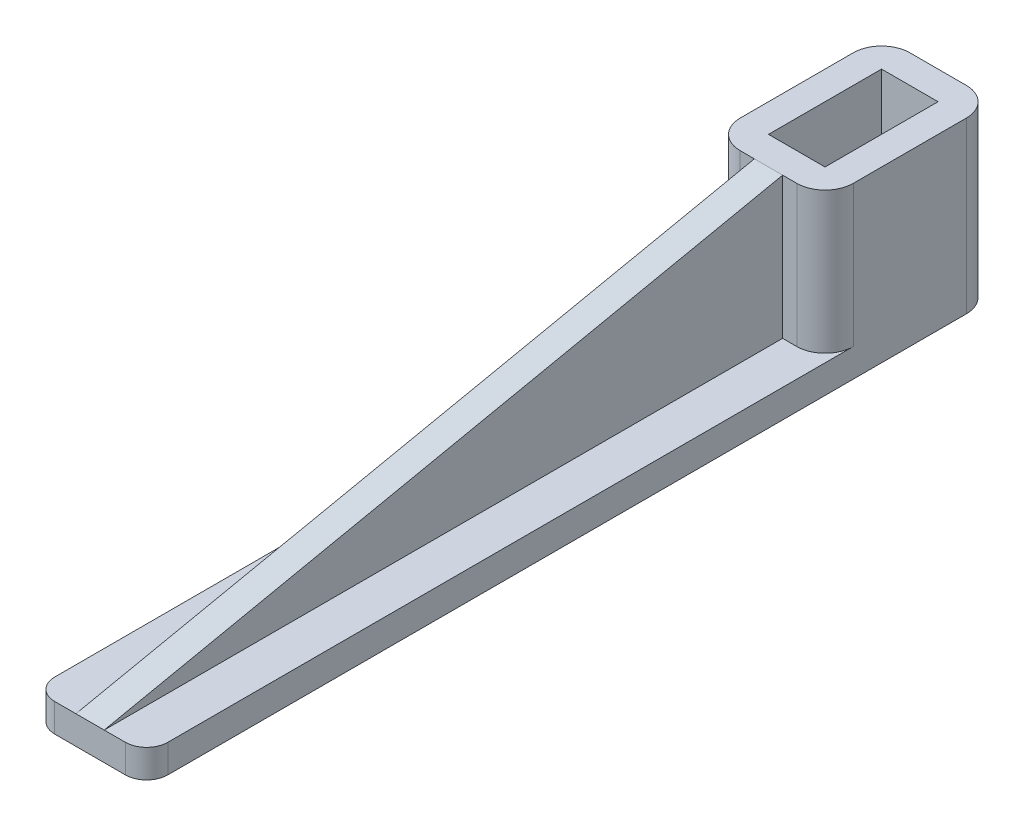
ISO-10303-21;
HEADER;
FILE_DESCRIPTION(('STEP AP214'),'2;1');
FILE_NAME('part.step','',(''),(''),'','','');
FILE_SCHEMA(('AUTOMOTIVE_DESIGN { 1 0 10303 214 1 1 1 1 }'));
ENDSEC;
DATA;
#1=APPLICATION_CONTEXT('core data for automotive mechanical design processes');
#2=APPLICATION_PROTOCOL_DEFINITION('international standard','automotive_design',2000,#1);
#3=PRODUCT_CONTEXT('',#1,'mechanical');
#4=PRODUCT('Part','Part','',(#3));
#5=PRODUCT_RELATED_PRODUCT_CATEGORY('part','',(#4));
#6=PRODUCT_DEFINITION_FORMATION('','',#4);
#7=PRODUCT_DEFINITION_CONTEXT('part definition',#1,'design');
#8=PRODUCT_DEFINITION('design','',#6,#7);
#9=PRODUCT_DEFINITION_SHAPE('','',#8);
#10=(LENGTH_UNIT() NAMED_UNIT(*) SI_UNIT(.MILLI.,.METRE.));
#11=(NAMED_UNIT(*) PLANE_ANGLE_UNIT() SI_UNIT($,.RADIAN.));
#12=(NAMED_UNIT(*) SI_UNIT($,.STERADIAN.) SOLID_ANGLE_UNIT());
#13=UNCERTAINTY_MEASURE_WITH_UNIT(LENGTH_MEASURE(1.E-05),#10,'distance_accuracy_value','');
#14=(GEOMETRIC_REPRESENTATION_CONTEXT(3) GLOBAL_UNCERTAINTY_ASSIGNED_CONTEXT((#13)) GLOBAL_UNIT_ASSIGNED_CONTEXT((#10,
#11,#12)) REPRESENTATION_CONTEXT('',''));
#15=CARTESIAN_POINT('',(0.,0.,0.));
#16=DIRECTION('',(0.,0.,1.));
#17=DIRECTION('',(1.,0.,0.));
#18=AXIS2_PLACEMENT_3D('',#15,#16,#17);
#19=CARTESIAN_POINT('',(0.,30.,15.));
#20=DIRECTION('',(0.,0.,-1.));
#21=DIRECTION('',(-1.,0.,0.));
#22=AXIS2_PLACEMENT_3D('',#19,#20,#21);
#23=PLANE('',#22);
#24=DIRECTION('',(1.,0.,0.));
#25=VECTOR('',#24,1.);
#26=CARTESIAN_POINT('',(0.,30.,15.));
#27=LINE('',#26,#25);
#28=CARTESIAN_POINT('',(-5.,30.,15.));
#29=VERTEX_POINT('',#28);
#30=CARTESIAN_POINT('',(-2.5,30.,15.0000000000001));
#31=VERTEX_POINT('',#30);
#32=EDGE_CURVE('E229',#29,#31,#27,.T.);
#33=ORIENTED_EDGE('',*,*,#32,.F.);
#34=DIRECTION('',(0.,-1.,0.));
#35=VECTOR('',#34,1.);
#36=CARTESIAN_POINT('',(-5.,5.,15.));
#37=LINE('',#36,#35);
#38=CARTESIAN_POINT('',(-5.,5.,15.));
#39=VERTEX_POINT('',#38);
#40=EDGE_CURVE('E263',#29,#39,#37,.T.);
#41=ORIENTED_EDGE('',*,*,#40,.T.);
#42=DIRECTION('',(1.,0.,0.));
#43=VECTOR('',#42,1.);
#44=CARTESIAN_POINT('',(0.,5.,15.));
#45=LINE('',#44,#43);
#46=CARTESIAN_POINT('',(-2.5,5.,15.));
#47=VERTEX_POINT('',#46);
#48=EDGE_CURVE('E345',#39,#47,#45,.T.);
#49=ORIENTED_EDGE('',*,*,#48,.T.);
#50=DIRECTION('',(0.,-1.,0.));
#51=VECTOR('',#50,1.);
#52=CARTESIAN_POINT('',(-2.5,30.,15.));
#53=LINE('',#52,#51);
#54=EDGE_CURVE('E174',#31,#47,#53,.T.);
#55=ORIENTED_EDGE('',*,*,#54,.F.);
#56=EDGE_LOOP('',(#33,#41,#49,#55));
#57=FACE_BOUND('',#56,.T.);
#58=ADVANCED_FACE('F37',(#57),#23,.F.);
#59=CARTESIAN_POINT('',(0.,5.,0.));
#60=DIRECTION('',(0.,1.,0.));
#61=DIRECTION('',(0.,0.,1.));
#62=AXIS2_PLACEMENT_3D('',#59,#60,#61);
#63=PLANE('',#62);
#64=DIRECTION('',(0.,0.,-1.));
#65=VECTOR('',#64,1.);
#66=CARTESIAN_POINT('',(-10.,5.,0.));
#67=LINE('',#66,#65);
#68=CARTESIAN_POINT('',(-9.99999999999999,5.,131.25));
#69=VERTEX_POINT('',#68);
#70=CARTESIAN_POINT('',(-10.,5.,10.));
#71=VERTEX_POINT('',#70);
#72=EDGE_CURVE('E201',#69,#71,#67,.T.);
#73=ORIENTED_EDGE('',*,*,#72,.F.);
#74=CARTESIAN_POINT('',(-6.25,5.,131.25));
#75=DIRECTION('',(0.,1.,0.));
#76=DIRECTION('',(0.,0.,1.));
#77=AXIS2_PLACEMENT_3D('',#74,#75,#76);
#78=CIRCLE('',#77,3.75);
#79=CARTESIAN_POINT('',(-6.25,5.,135.));
#80=VERTEX_POINT('',#79);
#81=EDGE_CURVE('E197',#69,#80,#78,.T.);
#82=ORIENTED_EDGE('',*,*,#81,.T.);
#83=DIRECTION('',(-1.,0.,0.));
#84=VECTOR('',#83,1.);
#85=CARTESIAN_POINT('',(0.,5.,135.));
#86=LINE('',#85,#84);
#87=CARTESIAN_POINT('',(-2.5,5.,135.));
#88=VERTEX_POINT('',#87);
#89=EDGE_CURVE('E194',#88,#80,#86,.T.);
#90=ORIENTED_EDGE('',*,*,#89,.F.);
#91=DIRECTION('',(0.,0.,-1.));
#92=VECTOR('',#91,1.);
#93=CARTESIAN_POINT('',(-2.5,5.,0.));
#94=LINE('',#93,#92);
#95=EDGE_CURVE('E169',#88,#47,#94,.T.);
#96=ORIENTED_EDGE('',*,*,#95,.T.);
#97=ORIENTED_EDGE('',*,*,#48,.F.);
#98=CARTESIAN_POINT('',(-5.,5.,10.));
#99=DIRECTION('',(0.,1.,0.));
#100=DIRECTION('',(0.,0.,1.));
#101=AXIS2_PLACEMENT_3D('',#98,#99,#100);
#102=CIRCLE('',#101,5.);
#103=EDGE_CURVE('E295',#39,#71,#102,.F.);
#104=ORIENTED_EDGE('',*,*,#103,.T.);
#105=EDGE_LOOP('',(#73,#82,#90,#96,#97,#104));
#106=FACE_BOUND('',#105,.T.);
#107=ADVANCED_FACE('F195',(#106),#63,.T.);
#108=CARTESIAN_POINT('',(-10.,30.,0.));
#109=DIRECTION('',(-1.,0.,0.));
#110=DIRECTION('',(0.,0.,1.));
#111=AXIS2_PLACEMENT_3D('',#108,#109,#110);
#112=PLANE('',#111);
#113=DIRECTION('',(0.,0.,-1.));
#114=VECTOR('',#113,1.);
#115=CARTESIAN_POINT('',(-10.,0.,0.));
#116=LINE('',#115,#114);
#117=CARTESIAN_POINT('',(-9.99999999999999,0.,131.25));
#118=VERTEX_POINT('',#117);
#119=CARTESIAN_POINT('',(-10.,0.,-9.99999999999999));
#120=VERTEX_POINT('',#119);
#121=EDGE_CURVE('E246',#118,#120,#116,.T.);
#122=ORIENTED_EDGE('',*,*,#121,.F.);
#123=DIRECTION('',(0.,-1.,0.));
#124=VECTOR('',#123,1.);
#125=CARTESIAN_POINT('',(-9.99999999999999,30.,131.25));
#126=LINE('',#125,#124);
#127=EDGE_CURVE('E58',#118,#69,#126,.F.);
#128=ORIENTED_EDGE('',*,*,#127,.T.);
#129=ORIENTED_EDGE('',*,*,#72,.T.);
#130=DIRECTION('',(0.,-1.,0.));
#131=VECTOR('',#130,1.);
#132=CARTESIAN_POINT('',(-10.,30.,10.));
#133=LINE('',#132,#131);
#134=CARTESIAN_POINT('',(-10.,30.,10.));
#135=VERTEX_POINT('',#134);
#136=EDGE_CURVE('E269',#71,#135,#133,.F.);
#137=ORIENTED_EDGE('',*,*,#136,.T.);
#138=DIRECTION('',(0.,0.,-1.));
#139=VECTOR('',#138,1.);
#140=CARTESIAN_POINT('',(-10.,30.,0.));
#141=LINE('',#140,#139);
#142=CARTESIAN_POINT('',(-10.,30.,-9.99999999999999));
#143=VERTEX_POINT('',#142);
#144=EDGE_CURVE('E225',#135,#143,#141,.T.);
#145=ORIENTED_EDGE('',*,*,#144,.T.);
#146=DIRECTION('',(0.,-1.,0.));
#147=VECTOR('',#146,1.);
#148=CARTESIAN_POINT('',(-10.,30.,-9.99999999999999));
#149=LINE('',#148,#147);
#150=EDGE_CURVE('E266',#143,#120,#149,.T.);
#151=ORIENTED_EDGE('',*,*,#150,.T.);
#152=EDGE_LOOP('',(#122,#128,#129,#137,#145,#151));
#153=FACE_BOUND('',#152,.T.);
#154=ADVANCED_FACE('F337',(#153),#112,.T.);
#155=CARTESIAN_POINT('',(2.5,5.,15.));
#156=VERTEX_POINT('',#155);
#157=CARTESIAN_POINT('',(5.,5.,15.));
#158=VERTEX_POINT('',#157);
#159=EDGE_CURVE('E214',#156,#158,#45,.T.);
#160=ORIENTED_EDGE('',*,*,#159,.T.);
#161=DIRECTION('',(0.,-1.,0.));
#162=VECTOR('',#161,1.);
#163=CARTESIAN_POINT('',(5.,30.,15.));
#164=LINE('',#163,#162);
#165=CARTESIAN_POINT('',(5.,30.,15.));
#166=VERTEX_POINT('',#165);
#167=EDGE_CURVE('E293',#158,#166,#164,.F.);
#168=ORIENTED_EDGE('',*,*,#167,.T.);
#169=CARTESIAN_POINT('',(2.5,30.,15.0000000000001));
#170=VERTEX_POINT('',#169);
#171=EDGE_CURVE('E228',#170,#166,#27,.T.);
#172=ORIENTED_EDGE('',*,*,#171,.F.);
#173=DIRECTION('',(0.,-1.,0.));
#174=VECTOR('',#173,1.);
#175=CARTESIAN_POINT('',(2.5,30.,15.));
#176=LINE('',#175,#174);
#177=EDGE_CURVE('E349',#170,#156,#176,.T.);
#178=ORIENTED_EDGE('',*,*,#177,.T.);
#179=EDGE_LOOP('',(#160,#168,#172,#178));
#180=FACE_BOUND('',#179,.T.);
#181=ADVANCED_FACE('F358',(#180),#23,.F.);
#182=CARTESIAN_POINT('',(10.,30.,0.));
#183=DIRECTION('',(1.,0.,0.));
#184=DIRECTION('',(0.,0.,-1.));
#185=AXIS2_PLACEMENT_3D('',#182,#183,#184);
#186=PLANE('',#185);
#187=DIRECTION('',(0.,0.,1.));
#188=VECTOR('',#187,1.);
#189=CARTESIAN_POINT('',(10.,5.,0.));
#190=LINE('',#189,#188);
#191=CARTESIAN_POINT('',(10.,5.,10.));
#192=VERTEX_POINT('',#191);
#193=CARTESIAN_POINT('',(10.,5.,131.25));
#194=VERTEX_POINT('',#193);
#195=EDGE_CURVE('E205',#192,#194,#190,.T.);
#196=ORIENTED_EDGE('',*,*,#195,.T.);
#197=DIRECTION('',(0.,-1.,0.));
#198=VECTOR('',#197,1.);
#199=CARTESIAN_POINT('',(10.,30.,131.25));
#200=LINE('',#199,#198);
#201=CARTESIAN_POINT('',(10.,0.,131.25));
#202=VERTEX_POINT('',#201);
#203=EDGE_CURVE('E45',#194,#202,#200,.T.);
#204=ORIENTED_EDGE('',*,*,#203,.T.);
#205=DIRECTION('',(0.,0.,1.));
#206=VECTOR('',#205,1.);
#207=CARTESIAN_POINT('',(10.,0.,0.));
#208=LINE('',#207,#206);
#209=CARTESIAN_POINT('',(10.,0.,-10.));
#210=VERTEX_POINT('',#209);
#211=EDGE_CURVE('E248',#210,#202,#208,.T.);
#212=ORIENTED_EDGE('',*,*,#211,.F.);
#213=DIRECTION('',(0.,-1.,0.));
#214=VECTOR('',#213,1.);
#215=CARTESIAN_POINT('',(10.,30.,-10.));
#216=LINE('',#215,#214);
#217=CARTESIAN_POINT('',(10.,30.,-10.));
#218=VERTEX_POINT('',#217);
#219=EDGE_CURVE('E291',#210,#218,#216,.F.);
#220=ORIENTED_EDGE('',*,*,#219,.T.);
#221=DIRECTION('',(0.,0.,1.));
#222=VECTOR('',#221,1.);
#223=CARTESIAN_POINT('',(10.,30.,0.));
#224=LINE('',#223,#222);
#225=CARTESIAN_POINT('',(10.,30.,10.));
#226=VERTEX_POINT('',#225);
#227=EDGE_CURVE('E231',#218,#226,#224,.T.);
#228=ORIENTED_EDGE('',*,*,#227,.T.);
#229=DIRECTION('',(0.,-1.,0.));
#230=VECTOR('',#229,1.);
#231=CARTESIAN_POINT('',(10.,5.,10.));
#232=LINE('',#231,#230);
#233=EDGE_CURVE('E288',#226,#192,#232,.T.);
#234=ORIENTED_EDGE('',*,*,#233,.T.);
#235=EDGE_LOOP('',(#196,#204,#212,#220,#228,#234));
#236=FACE_BOUND('',#235,.T.);
#237=ADVANCED_FACE('F313',(#236),#186,.T.);
#238=CARTESIAN_POINT('',(-5.,30.,0.));
#239=DIRECTION('',(1.,0.,0.));
#240=DIRECTION('',(0.,0.,-1.));
#241=AXIS2_PLACEMENT_3D('',#238,#239,#240);
#242=PLANE('',#241);
#243=DIRECTION('',(0.,0.,1.));
#244=VECTOR('',#243,1.);
#245=CARTESIAN_POINT('',(-5.,0.,0.));
#246=LINE('',#245,#244);
#247=CARTESIAN_POINT('',(-5.,0.,-10.));
#248=VERTEX_POINT('',#247);
#249=CARTESIAN_POINT('',(-5.,0.,10.));
#250=VERTEX_POINT('',#249);
#251=EDGE_CURVE('E210',#248,#250,#246,.T.);
#252=ORIENTED_EDGE('',*,*,#251,.F.);
#253=DIRECTION('',(0.,-1.,0.));
#254=VECTOR('',#253,1.);
#255=CARTESIAN_POINT('',(-5.,30.,-10.));
#256=LINE('',#255,#254);
#257=CARTESIAN_POINT('',(-5.,30.,-10.));
#258=VERTEX_POINT('',#257);
#259=EDGE_CURVE('E179',#258,#248,#256,.T.);
#260=ORIENTED_EDGE('',*,*,#259,.F.);
#261=DIRECTION('',(0.,0.,1.));
#262=VECTOR('',#261,1.);
#263=CARTESIAN_POINT('',(-5.,30.,0.));
#264=LINE('',#263,#262);
#265=CARTESIAN_POINT('',(-5.,30.,10.));
#266=VERTEX_POINT('',#265);
#267=EDGE_CURVE('E215',#258,#266,#264,.T.);
#268=ORIENTED_EDGE('',*,*,#267,.T.);
#269=DIRECTION('',(0.,-1.,0.));
#270=VECTOR('',#269,1.);
#271=CARTESIAN_POINT('',(-5.,30.,10.));
#272=LINE('',#271,#270);
#273=EDGE_CURVE('E237',#266,#250,#272,.T.);
#274=ORIENTED_EDGE('',*,*,#273,.T.);
#275=EDGE_LOOP('',(#252,#260,#268,#274));
#276=FACE_BOUND('',#275,.T.);
#277=ADVANCED_FACE('F389',(#276),#242,.T.);
#278=CARTESIAN_POINT('',(0.,30.,-10.));
#279=DIRECTION('',(0.,0.,1.));
#280=DIRECTION('',(1.,0.,0.));
#281=AXIS2_PLACEMENT_3D('',#278,#279,#280);
#282=PLANE('',#281);
#283=DIRECTION('',(-1.,0.,0.));
#284=VECTOR('',#283,1.);
#285=CARTESIAN_POINT('',(0.,30.,-10.));
#286=LINE('',#285,#284);
#287=CARTESIAN_POINT('',(5.,30.,-10.));
#288=VERTEX_POINT('',#287);
#289=EDGE_CURVE('E218',#288,#258,#286,.T.);
#290=ORIENTED_EDGE('',*,*,#289,.T.);
#291=ORIENTED_EDGE('',*,*,#259,.T.);
#292=DIRECTION('',(-1.,0.,0.));
#293=VECTOR('',#292,1.);
#294=CARTESIAN_POINT('',(0.,0.,-10.));
#295=LINE('',#294,#293);
#296=CARTESIAN_POINT('',(5.,0.,-10.));
#297=VERTEX_POINT('',#296);
#298=EDGE_CURVE('E240',#297,#248,#295,.T.);
#299=ORIENTED_EDGE('',*,*,#298,.F.);
#300=DIRECTION('',(0.,-1.,0.));
#301=VECTOR('',#300,1.);
#302=CARTESIAN_POINT('',(5.,30.,-10.));
#303=LINE('',#302,#301);
#304=EDGE_CURVE('E258',#288,#297,#303,.T.);
#305=ORIENTED_EDGE('',*,*,#304,.F.);
#306=EDGE_LOOP('',(#290,#291,#299,#305));
#307=FACE_BOUND('',#306,.T.);
#308=ADVANCED_FACE('F400',(#307),#282,.T.);
#309=CARTESIAN_POINT('',(5.,30.,0.));
#310=DIRECTION('',(1.,0.,0.));
#311=DIRECTION('',(0.,0.,-1.));
#312=AXIS2_PLACEMENT_3D('',#309,#310,#311);
#313=PLANE('',#312);
#314=DIRECTION('',(0.,0.,1.));
#315=VECTOR('',#314,1.);
#316=CARTESIAN_POINT('',(5.,0.,0.));
#317=LINE('',#316,#315);
#318=CARTESIAN_POINT('',(5.,0.,10.));
#319=VERTEX_POINT('',#318);
#320=EDGE_CURVE('E242',#297,#319,#317,.T.);
#321=ORIENTED_EDGE('',*,*,#320,.T.);
#322=DIRECTION('',(0.,-1.,0.));
#323=VECTOR('',#322,1.);
#324=CARTESIAN_POINT('',(5.,30.,10.));
#325=LINE('',#324,#323);
#326=CARTESIAN_POINT('',(5.,30.,10.));
#327=VERTEX_POINT('',#326);
#328=EDGE_CURVE('E255',#327,#319,#325,.T.);
#329=ORIENTED_EDGE('',*,*,#328,.F.);
#330=DIRECTION('',(0.,0.,1.));
#331=VECTOR('',#330,1.);
#332=CARTESIAN_POINT('',(5.,30.,0.));
#333=LINE('',#332,#331);
#334=EDGE_CURVE('E221',#288,#327,#333,.T.);
#335=ORIENTED_EDGE('',*,*,#334,.F.);
#336=ORIENTED_EDGE('',*,*,#304,.T.);
#337=EDGE_LOOP('',(#321,#329,#335,#336));
#338=FACE_BOUND('',#337,.T.);
#339=ADVANCED_FACE('F396',(#338),#313,.F.);
#340=CARTESIAN_POINT('',(0.,30.,10.));
#341=DIRECTION('',(0.,0.,1.));
#342=DIRECTION('',(1.,0.,0.));
#343=AXIS2_PLACEMENT_3D('',#340,#341,#342);
#344=PLANE('',#343);
#345=DIRECTION('',(-1.,0.,0.));
#346=VECTOR('',#345,1.);
#347=CARTESIAN_POINT('',(0.,0.,10.));
#348=LINE('',#347,#346);
#349=EDGE_CURVE('E244',#319,#250,#348,.T.);
#350=ORIENTED_EDGE('',*,*,#349,.T.);
#351=ORIENTED_EDGE('',*,*,#273,.F.);
#352=DIRECTION('',(-1.,0.,0.));
#353=VECTOR('',#352,1.);
#354=CARTESIAN_POINT('',(0.,30.,10.));
#355=LINE('',#354,#353);
#356=EDGE_CURVE('E223',#327,#266,#355,.T.);
#357=ORIENTED_EDGE('',*,*,#356,.F.);
#358=ORIENTED_EDGE('',*,*,#328,.T.);
#359=EDGE_LOOP('',(#350,#351,#357,#358));
#360=FACE_BOUND('',#359,.T.);
#361=ADVANCED_FACE('F393',(#360),#344,.F.);
#362=CARTESIAN_POINT('',(0.,30.,-15.));
#363=DIRECTION('',(0.,0.,-1.));
#364=DIRECTION('',(-1.,0.,0.));
#365=AXIS2_PLACEMENT_3D('',#362,#363,#364);
#366=PLANE('',#365);
#367=DIRECTION('',(1.,0.,0.));
#368=VECTOR('',#367,1.);
#369=CARTESIAN_POINT('',(0.,0.,-15.));
#370=LINE('',#369,#368);
#371=CARTESIAN_POINT('',(-5.,0.,-15.));
#372=VERTEX_POINT('',#371);
#373=CARTESIAN_POINT('',(5.,0.,-15.));
#374=VERTEX_POINT('',#373);
#375=EDGE_CURVE('E219',#372,#374,#370,.T.);
#376=ORIENTED_EDGE('',*,*,#375,.F.);
#377=DIRECTION('',(0.,-1.,0.));
#378=VECTOR('',#377,1.);
#379=CARTESIAN_POINT('',(-5.,30.,-15.));
#380=LINE('',#379,#378);
#381=CARTESIAN_POINT('',(-5.,30.,-15.));
#382=VERTEX_POINT('',#381);
#383=EDGE_CURVE('E286',#372,#382,#380,.F.);
#384=ORIENTED_EDGE('',*,*,#383,.T.);
#385=DIRECTION('',(1.,0.,0.));
#386=VECTOR('',#385,1.);
#387=CARTESIAN_POINT('',(0.,30.,-15.));
#388=LINE('',#387,#386);
#389=CARTESIAN_POINT('',(5.,30.,-15.));
#390=VERTEX_POINT('',#389);
#391=EDGE_CURVE('E234',#382,#390,#388,.T.);
#392=ORIENTED_EDGE('',*,*,#391,.T.);
#393=DIRECTION('',(0.,-1.,0.));
#394=VECTOR('',#393,1.);
#395=CARTESIAN_POINT('',(5.,30.,-15.));
#396=LINE('',#395,#394);
#397=EDGE_CURVE('E283',#390,#374,#396,.T.);
#398=ORIENTED_EDGE('',*,*,#397,.T.);
#399=EDGE_LOOP('',(#376,#384,#392,#398));
#400=FACE_BOUND('',#399,.T.);
#401=ADVANCED_FACE('F325',(#400),#366,.T.);
#402=CARTESIAN_POINT('',(0.,30.,0.));
#403=DIRECTION('',(0.,1.,0.));
#404=DIRECTION('',(0.,0.,1.));
#405=AXIS2_PLACEMENT_3D('',#402,#403,#404);
#406=PLANE('',#405);
#407=ORIENTED_EDGE('',*,*,#356,.T.);
#408=ORIENTED_EDGE('',*,*,#267,.F.);
#409=ORIENTED_EDGE('',*,*,#289,.F.);
#410=ORIENTED_EDGE('',*,*,#334,.T.);
#411=EDGE_LOOP('',(#407,#408,#409,#410));
#412=FACE_BOUND('',#411,.T.);
#413=ORIENTED_EDGE('',*,*,#144,.F.);
#414=CARTESIAN_POINT('',(-5.,30.,10.));
#415=DIRECTION('',(0.,1.,0.));
#416=DIRECTION('',(0.,0.,1.));
#417=AXIS2_PLACEMENT_3D('',#414,#415,#416);
#418=CIRCLE('',#417,5.);
#419=EDGE_CURVE('E277',#135,#29,#418,.T.);
#420=ORIENTED_EDGE('',*,*,#419,.T.);
#421=ORIENTED_EDGE('',*,*,#32,.T.);
#422=DIRECTION('',(-1.,0.,0.));
#423=VECTOR('',#422,1.);
#424=CARTESIAN_POINT('',(0.,30.,15.));
#425=LINE('',#424,#423);
#426=EDGE_CURVE('E190',#31,#170,#425,.F.);
#427=ORIENTED_EDGE('',*,*,#426,.T.);
#428=ORIENTED_EDGE('',*,*,#171,.T.);
#429=CARTESIAN_POINT('',(5.,30.,10.));
#430=DIRECTION('',(0.,1.,0.));
#431=DIRECTION('',(0.,0.,1.));
#432=AXIS2_PLACEMENT_3D('',#429,#430,#431);
#433=CIRCLE('',#432,5.);
#434=EDGE_CURVE('E271',#166,#226,#433,.T.);
#435=ORIENTED_EDGE('',*,*,#434,.T.);
#436=ORIENTED_EDGE('',*,*,#227,.F.);
#437=CARTESIAN_POINT('',(5.,30.,-9.99999999999999));
#438=DIRECTION('',(0.,1.,0.));
#439=DIRECTION('',(0.,0.,1.));
#440=AXIS2_PLACEMENT_3D('',#437,#438,#439);
#441=CIRCLE('',#440,5.);
#442=EDGE_CURVE('E273',#218,#390,#441,.T.);
#443=ORIENTED_EDGE('',*,*,#442,.T.);
#444=ORIENTED_EDGE('',*,*,#391,.F.);
#445=CARTESIAN_POINT('',(-5.,30.,-9.99999999999999));
#446=DIRECTION('',(0.,1.,0.));
#447=DIRECTION('',(0.,0.,1.));
#448=AXIS2_PLACEMENT_3D('',#445,#446,#447);
#449=CIRCLE('',#448,5.);
#450=EDGE_CURVE('E275',#382,#143,#449,.T.);
#451=ORIENTED_EDGE('',*,*,#450,.T.);
#452=EDGE_LOOP('',(#413,#420,#421,#427,#428,#435,#436,#443,#444,#451));
#453=FACE_BOUND('',#452,.T.);
#454=ADVANCED_FACE('F331',(#412,#453),#406,.T.);
#455=CARTESIAN_POINT('',(0.,0.,0.));
#456=DIRECTION('',(0.,1.,0.));
#457=DIRECTION('',(0.,0.,1.));
#458=AXIS2_PLACEMENT_3D('',#455,#456,#457);
#459=PLANE('',#458);
#460=ORIENTED_EDGE('',*,*,#251,.T.);
#461=ORIENTED_EDGE('',*,*,#349,.F.);
#462=ORIENTED_EDGE('',*,*,#320,.F.);
#463=ORIENTED_EDGE('',*,*,#298,.T.);
#464=EDGE_LOOP('',(#460,#461,#462,#463));
#465=FACE_BOUND('',#464,.T.);
#466=DIRECTION('',(-1.,0.,0.));
#467=VECTOR('',#466,1.);
#468=CARTESIAN_POINT('',(0.,0.,135.));
#469=LINE('',#468,#467);
#470=CARTESIAN_POINT('',(6.25000000000003,0.,135.));
#471=VERTEX_POINT('',#470);
#472=CARTESIAN_POINT('',(-6.25,0.,135.));
#473=VERTEX_POINT('',#472);
#474=EDGE_CURVE('E211',#471,#473,#469,.T.);
#475=ORIENTED_EDGE('',*,*,#474,.T.);
#476=CARTESIAN_POINT('',(-6.25,0.,131.25));
#477=DIRECTION('',(0.,1.,0.));
#478=DIRECTION('',(0.,0.,1.));
#479=AXIS2_PLACEMENT_3D('',#476,#477,#478);
#480=CIRCLE('',#479,3.75);
#481=EDGE_CURVE('E306',#473,#118,#480,.F.);
#482=ORIENTED_EDGE('',*,*,#481,.T.);
#483=ORIENTED_EDGE('',*,*,#121,.T.);
#484=CARTESIAN_POINT('',(-5.,0.,-9.99999999999999));
#485=DIRECTION('',(0.,1.,0.));
#486=DIRECTION('',(0.,0.,1.));
#487=AXIS2_PLACEMENT_3D('',#484,#485,#486);
#488=CIRCLE('',#487,5.);
#489=EDGE_CURVE('E281',#120,#372,#488,.F.);
#490=ORIENTED_EDGE('',*,*,#489,.T.);
#491=ORIENTED_EDGE('',*,*,#375,.T.);
#492=CARTESIAN_POINT('',(5.,0.,-9.99999999999999));
#493=DIRECTION('',(0.,1.,0.));
#494=DIRECTION('',(0.,0.,1.));
#495=AXIS2_PLACEMENT_3D('',#492,#493,#494);
#496=CIRCLE('',#495,5.);
#497=EDGE_CURVE('E279',#374,#210,#496,.F.);
#498=ORIENTED_EDGE('',*,*,#497,.T.);
#499=ORIENTED_EDGE('',*,*,#211,.T.);
#500=CARTESIAN_POINT('',(6.25000000000003,0.,131.25));
#501=DIRECTION('',(0.,1.,0.));
#502=DIRECTION('',(0.,0.,1.));
#503=AXIS2_PLACEMENT_3D('',#500,#501,#502);
#504=CIRCLE('',#503,3.75);
#505=EDGE_CURVE('E304',#202,#471,#504,.F.);
#506=ORIENTED_EDGE('',*,*,#505,.T.);
#507=EDGE_LOOP('',(#475,#482,#483,#490,#491,#498,#499,#506));
#508=FACE_BOUND('',#507,.T.);
#509=ADVANCED_FACE('F317',(#465,#508),#459,.F.);
#510=CARTESIAN_POINT('',(0.,5.,135.));
#511=DIRECTION('',(0.,0.,1.));
#512=DIRECTION('',(1.,0.,0.));
#513=AXIS2_PLACEMENT_3D('',#510,#511,#512);
#514=PLANE('',#513);
#515=ORIENTED_EDGE('',*,*,#89,.T.);
#516=DIRECTION('',(0.,-1.,0.));
#517=VECTOR('',#516,1.);
#518=CARTESIAN_POINT('',(-6.25,5.,135.));
#519=LINE('',#518,#517);
#520=EDGE_CURVE('E302',#80,#473,#519,.T.);
#521=ORIENTED_EDGE('',*,*,#520,.T.);
#522=ORIENTED_EDGE('',*,*,#474,.F.);
#523=DIRECTION('',(0.,-1.,0.));
#524=VECTOR('',#523,1.);
#525=CARTESIAN_POINT('',(6.25000000000003,5.,135.));
#526=LINE('',#525,#524);
#527=CARTESIAN_POINT('',(6.25000000000003,5.,135.));
#528=VERTEX_POINT('',#527);
#529=EDGE_CURVE('E300',#471,#528,#526,.F.);
#530=ORIENTED_EDGE('',*,*,#529,.T.);
#531=CARTESIAN_POINT('',(2.5,5.,135.));
#532=VERTEX_POINT('',#531);
#533=EDGE_CURVE('E203',#528,#532,#86,.T.);
#534=ORIENTED_EDGE('',*,*,#533,.T.);
#535=EDGE_CURVE('E187',#532,#88,#86,.T.);
#536=ORIENTED_EDGE('',*,*,#535,.T.);
#537=EDGE_LOOP('',(#515,#521,#522,#530,#534,#536));
#538=FACE_BOUND('',#537,.T.);
#539=ADVANCED_FACE('F204',(#538),#514,.T.);
#540=ORIENTED_EDGE('',*,*,#533,.F.);
#541=CARTESIAN_POINT('',(6.25000000000003,5.,131.25));
#542=DIRECTION('',(0.,1.,0.));
#543=DIRECTION('',(0.,0.,1.));
#544=AXIS2_PLACEMENT_3D('',#541,#542,#543);
#545=CIRCLE('',#544,3.75);
#546=EDGE_CURVE('E11',#528,#194,#545,.T.);
#547=ORIENTED_EDGE('',*,*,#546,.T.);
#548=ORIENTED_EDGE('',*,*,#195,.F.);
#549=CARTESIAN_POINT('',(5.,5.,10.));
#550=DIRECTION('',(0.,1.,0.));
#551=DIRECTION('',(0.,0.,1.));
#552=AXIS2_PLACEMENT_3D('',#549,#550,#551);
#553=CIRCLE('',#552,5.);
#554=EDGE_CURVE('E298',#192,#158,#553,.F.);
#555=ORIENTED_EDGE('',*,*,#554,.T.);
#556=ORIENTED_EDGE('',*,*,#159,.F.);
#557=DIRECTION('',(0.,0.,-1.));
#558=VECTOR('',#557,1.);
#559=CARTESIAN_POINT('',(2.5,5.,0.));
#560=LINE('',#559,#558);
#561=EDGE_CURVE('E178',#532,#156,#560,.T.);
#562=ORIENTED_EDGE('',*,*,#561,.F.);
#563=EDGE_LOOP('',(#540,#547,#548,#555,#556,#562));
#564=FACE_BOUND('',#563,.T.);
#565=ADVANCED_FACE('F366',(#564),#63,.T.);
#566=CARTESIAN_POINT('',(0.,5.,135.));
#567=DIRECTION('',(0.,-0.978980419737605,-0.203954254112001));
#568=DIRECTION('',(0.,0.203954254112001,-0.978980419737605));
#569=AXIS2_PLACEMENT_3D('',#566,#567,#568);
#570=PLANE('',#569);
#571=ORIENTED_EDGE('',*,*,#426,.F.);
#572=DIRECTION('',(0.,0.203954254112001,-0.978980419737605));
#573=VECTOR('',#572,1.);
#574=CARTESIAN_POINT('',(-2.5,5.,135.));
#575=LINE('',#574,#573);
#576=EDGE_CURVE('E172',#88,#31,#575,.T.);
#577=ORIENTED_EDGE('',*,*,#576,.F.);
#578=ORIENTED_EDGE('',*,*,#535,.F.);
#579=DIRECTION('',(0.,0.203954254112001,-0.978980419737605));
#580=VECTOR('',#579,1.);
#581=CARTESIAN_POINT('',(2.5,5.,135.));
#582=LINE('',#581,#580);
#583=EDGE_CURVE('E191',#532,#170,#582,.T.);
#584=ORIENTED_EDGE('',*,*,#583,.T.);
#585=EDGE_LOOP('',(#571,#577,#578,#584));
#586=FACE_BOUND('',#585,.T.);
#587=ADVANCED_FACE('F184',(#586),#570,.F.);
#588=CARTESIAN_POINT('',(2.5,15.,60.));
#589=DIRECTION('',(1.,0.,0.));
#590=DIRECTION('',(0.,0.,-1.));
#591=AXIS2_PLACEMENT_3D('',#588,#589,#590);
#592=PLANE('',#591);
#593=ORIENTED_EDGE('',*,*,#177,.F.);
#594=ORIENTED_EDGE('',*,*,#583,.F.);
#595=ORIENTED_EDGE('',*,*,#561,.T.);
#596=EDGE_LOOP('',(#593,#594,#595));
#597=FACE_BOUND('',#596,.T.);
#598=ADVANCED_FACE('F367',(#597),#592,.T.);
#599=CARTESIAN_POINT('',(-2.5,15.,60.));
#600=DIRECTION('',(1.,0.,0.));
#601=DIRECTION('',(0.,0.,-1.));
#602=AXIS2_PLACEMENT_3D('',#599,#600,#601);
#603=PLANE('',#602);
#604=ORIENTED_EDGE('',*,*,#576,.T.);
#605=ORIENTED_EDGE('',*,*,#54,.T.);
#606=ORIENTED_EDGE('',*,*,#95,.F.);
#607=EDGE_LOOP('',(#604,#605,#606));
#608=FACE_BOUND('',#607,.T.);
#609=ADVANCED_FACE('F171',(#608),#603,.F.);
#610=CARTESIAN_POINT('',(-5.,30.,10.));
#611=DIRECTION('',(0.,1.,0.));
#612=DIRECTION('',(0.,0.,1.));
#613=AXIS2_PLACEMENT_3D('',#610,#611,#612);
#614=CYLINDRICAL_SURFACE('',#613,5.);
#615=ORIENTED_EDGE('',*,*,#419,.F.);
#616=ORIENTED_EDGE('',*,*,#136,.F.);
#617=ORIENTED_EDGE('',*,*,#103,.F.);
#618=ORIENTED_EDGE('',*,*,#40,.F.);
#619=EDGE_LOOP('',(#615,#616,#617,#618));
#620=FACE_BOUND('',#619,.T.);
#621=ADVANCED_FACE('F343',(#620),#614,.T.);
#622=CARTESIAN_POINT('',(-5.,30.,-9.99999999999999));
#623=DIRECTION('',(0.,-1.,0.));
#624=DIRECTION('',(0.,0.,-1.));
#625=AXIS2_PLACEMENT_3D('',#622,#623,#624);
#626=CYLINDRICAL_SURFACE('',#625,5.);
#627=ORIENTED_EDGE('',*,*,#450,.F.);
#628=ORIENTED_EDGE('',*,*,#383,.F.);
#629=ORIENTED_EDGE('',*,*,#489,.F.);
#630=ORIENTED_EDGE('',*,*,#150,.F.);
#631=EDGE_LOOP('',(#627,#628,#629,#630));
#632=FACE_BOUND('',#631,.T.);
#633=ADVANCED_FACE('F335',(#632),#626,.T.);
#634=CARTESIAN_POINT('',(5.,30.,-9.99999999999999));
#635=DIRECTION('',(0.,-1.,0.));
#636=DIRECTION('',(0.,0.,-1.));
#637=AXIS2_PLACEMENT_3D('',#634,#635,#636);
#638=CYLINDRICAL_SURFACE('',#637,5.);
#639=ORIENTED_EDGE('',*,*,#442,.F.);
#640=ORIENTED_EDGE('',*,*,#219,.F.);
#641=ORIENTED_EDGE('',*,*,#497,.F.);
#642=ORIENTED_EDGE('',*,*,#397,.F.);
#643=EDGE_LOOP('',(#639,#640,#641,#642));
#644=FACE_BOUND('',#643,.T.);
#645=ADVANCED_FACE('F323',(#644),#638,.T.);
#646=CARTESIAN_POINT('',(5.,30.,10.));
#647=DIRECTION('',(0.,1.,0.));
#648=DIRECTION('',(0.,0.,1.));
#649=AXIS2_PLACEMENT_3D('',#646,#647,#648);
#650=CYLINDRICAL_SURFACE('',#649,5.);
#651=ORIENTED_EDGE('',*,*,#434,.F.);
#652=ORIENTED_EDGE('',*,*,#167,.F.);
#653=ORIENTED_EDGE('',*,*,#554,.F.);
#654=ORIENTED_EDGE('',*,*,#233,.F.);
#655=EDGE_LOOP('',(#651,#652,#653,#654));
#656=FACE_BOUND('',#655,.T.);
#657=ADVANCED_FACE('F364',(#656),#650,.T.);
#658=CARTESIAN_POINT('',(-6.25,5.,131.25));
#659=DIRECTION('',(0.,-1.,0.));
#660=DIRECTION('',(0.,0.,-1.));
#661=AXIS2_PLACEMENT_3D('',#658,#659,#660);
#662=CYLINDRICAL_SURFACE('',#661,3.75);
#663=ORIENTED_EDGE('',*,*,#81,.F.);
#664=ORIENTED_EDGE('',*,*,#127,.F.);
#665=ORIENTED_EDGE('',*,*,#481,.F.);
#666=ORIENTED_EDGE('',*,*,#520,.F.);
#667=EDGE_LOOP('',(#663,#664,#665,#666));
#668=FACE_BOUND('',#667,.T.);
#669=ADVANCED_FACE('F415',(#668),#662,.T.);
#670=CARTESIAN_POINT('',(6.25000000000003,30.,131.25));
#671=DIRECTION('',(0.,-1.,0.));
#672=DIRECTION('',(0.,0.,-1.));
#673=AXIS2_PLACEMENT_3D('',#670,#671,#672);
#674=CYLINDRICAL_SURFACE('',#673,3.75);
#675=ORIENTED_EDGE('',*,*,#546,.F.);
#676=ORIENTED_EDGE('',*,*,#529,.F.);
#677=ORIENTED_EDGE('',*,*,#505,.F.);
#678=ORIENTED_EDGE('',*,*,#203,.F.);
#679=EDGE_LOOP('',(#675,#676,#677,#678));
#680=FACE_BOUND('',#679,.T.);
#681=ADVANCED_FACE('F39',(#680),#674,.T.);
#682=CLOSED_SHELL('',(#58,#107,#154,#181,#237,#277,#308,#339,#361,#401,#454,#509,#539,#565,#587,
#598,#609,#621,#633,#645,#657,#669,#681));
#683=MANIFOLD_SOLID_BREP('B2',#682);
#684=ADVANCED_BREP_SHAPE_REPRESENTATION('',(#18,#683),#14);
#685=SHAPE_DEFINITION_REPRESENTATION(#9,#684);
ENDSEC;
END-ISO-10303-21;
